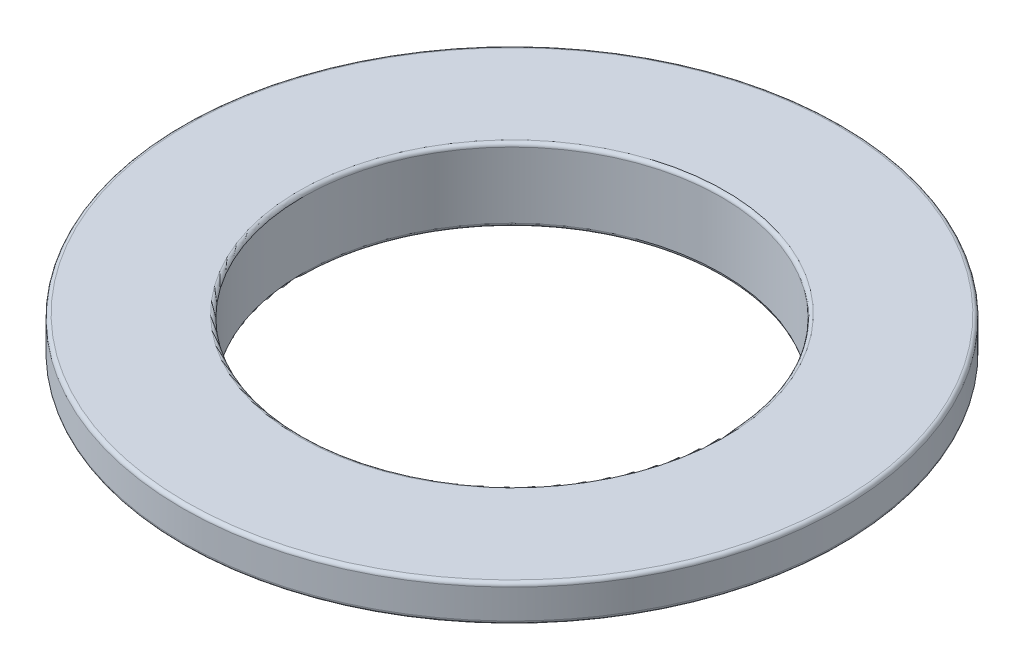
ISO-10303-21;
HEADER;
FILE_DESCRIPTION(('STEP AP214'),'2;1');
FILE_NAME('part.step','',(''),(''),'','','');
FILE_SCHEMA(('AUTOMOTIVE_DESIGN { 1 0 10303 214 1 1 1 1 }'));
ENDSEC;
DATA;
#1=APPLICATION_CONTEXT('core data for automotive mechanical design processes');
#2=APPLICATION_PROTOCOL_DEFINITION('international standard','automotive_design',2000,#1);
#3=PRODUCT_CONTEXT('',#1,'mechanical');
#4=PRODUCT('Part','Part','',(#3));
#5=PRODUCT_RELATED_PRODUCT_CATEGORY('part','',(#4));
#6=PRODUCT_DEFINITION_FORMATION('','',#4);
#7=PRODUCT_DEFINITION_CONTEXT('part definition',#1,'design');
#8=PRODUCT_DEFINITION('design','',#6,#7);
#9=PRODUCT_DEFINITION_SHAPE('','',#8);
#10=(LENGTH_UNIT() NAMED_UNIT(*) SI_UNIT(.MILLI.,.METRE.));
#11=(NAMED_UNIT(*) PLANE_ANGLE_UNIT() SI_UNIT($,.RADIAN.));
#12=(NAMED_UNIT(*) SI_UNIT($,.STERADIAN.) SOLID_ANGLE_UNIT());
#13=UNCERTAINTY_MEASURE_WITH_UNIT(LENGTH_MEASURE(1.E-05),#10,'distance_accuracy_value','');
#14=(GEOMETRIC_REPRESENTATION_CONTEXT(3) GLOBAL_UNCERTAINTY_ASSIGNED_CONTEXT((#13)) GLOBAL_UNIT_ASSIGNED_CONTEXT((#10,
#11,#12)) REPRESENTATION_CONTEXT('',''));
#15=CARTESIAN_POINT('',(0.,0.,0.));
#16=DIRECTION('',(0.,0.,1.));
#17=DIRECTION('',(1.,0.,0.));
#18=AXIS2_PLACEMENT_3D('',#15,#16,#17);
#19=CARTESIAN_POINT('',(0.,0.,0.));
#20=DIRECTION('',(0.,1.,0.));
#21=DIRECTION('',(0.,0.,1.));
#22=AXIS2_PLACEMENT_3D('',#19,#20,#21);
#23=PLANE('',#22);
#24=CARTESIAN_POINT('',(0.,0.,0.));
#25=DIRECTION('',(0.,1.,0.));
#26=DIRECTION('',(0.,0.,1.));
#27=AXIS2_PLACEMENT_3D('',#24,#25,#26);
#28=CIRCLE('',#27,16.5639320225002);
#29=CARTESIAN_POINT('',(0.,0.,16.5639320225002));
#30=VERTEX_POINT('',#29);
#31=EDGE_CURVE('E80',#30,#30,#28,.F.);
#32=ORIENTED_EDGE('',*,*,#31,.T.);
#33=EDGE_LOOP('',(#32));
#34=FACE_BOUND('',#33,.T.);
#35=CARTESIAN_POINT('',(0.,0.,0.));
#36=DIRECTION('',(0.,1.,0.));
#37=DIRECTION('',(0.,0.,1.));
#38=AXIS2_PLACEMENT_3D('',#35,#36,#37);
#39=CIRCLE('',#38,14.55);
#40=CARTESIAN_POINT('',(0.,0.,14.55));
#41=VERTEX_POINT('',#40);
#42=EDGE_CURVE('E83',#41,#41,#39,.T.);
#43=ORIENTED_EDGE('',*,*,#42,.T.);
#44=EDGE_LOOP('',(#43));
#45=FACE_BOUND('',#44,.T.);
#46=ADVANCED_FACE('F36',(#34,#45),#23,.F.);
#47=CARTESIAN_POINT('',(0.,0.,0.));
#48=DIRECTION('',(0.,-1.,0.));
#49=DIRECTION('',(0.,0.,-1.));
#50=AXIS2_PLACEMENT_3D('',#47,#48,#49);
#51=TOROIDAL_SURFACE('',#50,18.8,2.);
#52=CARTESIAN_POINT('',(0.,0.222222222222222,0.));
#53=DIRECTION('',(0.,-1.,0.));
#54=DIRECTION('',(0.,0.,-1.));
#55=AXIS2_PLACEMENT_3D('',#52,#53,#54);
#56=CIRCLE('',#55,16.8123840200002);
#57=CARTESIAN_POINT('',(0.,0.222222222222222,-16.8123840200002));
#58=VERTEX_POINT('',#57);
#59=EDGE_CURVE('E74',#58,#58,#56,.F.);
#60=ORIENTED_EDGE('',*,*,#59,.T.);
#61=EDGE_LOOP('',(#60));
#62=FACE_BOUND('',#61,.T.);
#63=CARTESIAN_POINT('',(0.,1.76886655485623,0.));
#64=DIRECTION('',(0.,-1.,0.));
#65=DIRECTION('',(0.,0.,-1.));
#66=AXIS2_PLACEMENT_3D('',#63,#64,#65);
#67=CIRCLE('',#66,17.8666666666667);
#68=CARTESIAN_POINT('',(0.,1.76886655485623,-17.8666666666667));
#69=VERTEX_POINT('',#68);
#70=EDGE_CURVE('E77',#69,#69,#67,.T.);
#71=ORIENTED_EDGE('',*,*,#70,.T.);
#72=EDGE_LOOP('',(#71));
#73=FACE_BOUND('',#72,.T.);
#74=ADVANCED_FACE('F113',(#62,#73),#51,.F.);
#75=CARTESIAN_POINT('',(0.,0.,0.));
#76=DIRECTION('',(0.,-1.,0.));
#77=DIRECTION('',(0.,0.,-1.));
#78=AXIS2_PLACEMENT_3D('',#75,#76,#77);
#79=CYLINDRICAL_SURFACE('',#78,18.);
#80=CARTESIAN_POINT('',(0.,1.98997487421324,0.));
#81=DIRECTION('',(0.,1.,0.));
#82=DIRECTION('',(0.,0.,1.));
#83=AXIS2_PLACEMENT_3D('',#80,#81,#82);
#84=CIRCLE('',#83,18.);
#85=CARTESIAN_POINT('',(0.,1.98997487421324,18.));
#86=VERTEX_POINT('',#85);
#87=EDGE_CURVE('E68',#86,#86,#84,.T.);
#88=ORIENTED_EDGE('',*,*,#87,.T.);
#89=EDGE_LOOP('',(#88));
#90=FACE_BOUND('',#89,.T.);
#91=CARTESIAN_POINT('',(0.,2.25,0.));
#92=DIRECTION('',(0.,-1.,0.));
#93=DIRECTION('',(0.,0.,-1.));
#94=AXIS2_PLACEMENT_3D('',#91,#92,#93);
#95=CIRCLE('',#94,18.);
#96=CARTESIAN_POINT('',(0.,2.25,-18.));
#97=VERTEX_POINT('',#96);
#98=EDGE_CURVE('E71',#97,#97,#95,.T.);
#99=ORIENTED_EDGE('',*,*,#98,.T.);
#100=EDGE_LOOP('',(#99));
#101=FACE_BOUND('',#100,.T.);
#102=ADVANCED_FACE('F119',(#90,#101),#79,.T.);
#103=CARTESIAN_POINT('',(0.,2.5,0.));
#104=DIRECTION('',(0.,-1.,0.));
#105=DIRECTION('',(0.,0.,-1.));
#106=AXIS2_PLACEMENT_3D('',#103,#104,#105);
#107=PLANE('',#106);
#108=CARTESIAN_POINT('',(0.,2.5,0.));
#109=DIRECTION('',(0.,-1.,0.));
#110=DIRECTION('',(0.,0.,-1.));
#111=AXIS2_PLACEMENT_3D('',#108,#109,#110);
#112=CIRCLE('',#111,18.25);
#113=CARTESIAN_POINT('',(0.,2.5,-18.25));
#114=VERTEX_POINT('',#113);
#115=EDGE_CURVE('E62',#114,#114,#112,.F.);
#116=ORIENTED_EDGE('',*,*,#115,.T.);
#117=EDGE_LOOP('',(#116));
#118=FACE_BOUND('',#117,.T.);
#119=CARTESIAN_POINT('',(0.,2.5,0.));
#120=DIRECTION('',(0.,-1.,0.));
#121=DIRECTION('',(0.,0.,-1.));
#122=AXIS2_PLACEMENT_3D('',#119,#120,#121);
#123=CIRCLE('',#122,22.25);
#124=CARTESIAN_POINT('',(0.,2.5,-22.25));
#125=VERTEX_POINT('',#124);
#126=EDGE_CURVE('E65',#125,#125,#123,.T.);
#127=ORIENTED_EDGE('',*,*,#126,.T.);
#128=EDGE_LOOP('',(#127));
#129=FACE_BOUND('',#128,.T.);
#130=ADVANCED_FACE('F142',(#118,#129),#107,.T.);
#131=CARTESIAN_POINT('',(0.,0.,0.));
#132=DIRECTION('',(0.,-1.,0.));
#133=DIRECTION('',(0.,0.,-1.));
#134=AXIS2_PLACEMENT_3D('',#131,#132,#133);
#135=CYLINDRICAL_SURFACE('',#134,22.5);
#136=CARTESIAN_POINT('',(0.,2.75,0.));
#137=DIRECTION('',(0.,-1.,0.));
#138=DIRECTION('',(0.,0.,-1.));
#139=AXIS2_PLACEMENT_3D('',#136,#137,#138);
#140=CIRCLE('',#139,22.5);
#141=CARTESIAN_POINT('',(0.,2.75,-22.5));
#142=VERTEX_POINT('',#141);
#143=EDGE_CURVE('E10',#142,#142,#140,.F.);
#144=ORIENTED_EDGE('',*,*,#143,.T.);
#145=EDGE_LOOP('',(#144));
#146=FACE_BOUND('',#145,.T.);
#147=CARTESIAN_POINT('',(0.,4.75,0.));
#148=DIRECTION('',(0.,1.,0.));
#149=DIRECTION('',(0.,0.,1.));
#150=AXIS2_PLACEMENT_3D('',#147,#148,#149);
#151=CIRCLE('',#150,22.5);
#152=CARTESIAN_POINT('',(0.,4.75,22.5));
#153=VERTEX_POINT('',#152);
#154=EDGE_CURVE('E43',#153,#153,#151,.F.);
#155=ORIENTED_EDGE('',*,*,#154,.T.);
#156=EDGE_LOOP('',(#155));
#157=FACE_BOUND('',#156,.T.);
#158=ADVANCED_FACE('F109',(#146,#157),#135,.T.);
#159=CARTESIAN_POINT('',(0.,5.,0.));
#160=DIRECTION('',(0.,1.,0.));
#161=DIRECTION('',(0.,0.,1.));
#162=AXIS2_PLACEMENT_3D('',#159,#160,#161);
#163=PLANE('',#162);
#164=CARTESIAN_POINT('',(0.,5.,0.));
#165=DIRECTION('',(0.,1.,0.));
#166=DIRECTION('',(0.,0.,1.));
#167=AXIS2_PLACEMENT_3D('',#164,#165,#166);
#168=CIRCLE('',#167,14.55);
#169=CARTESIAN_POINT('',(0.,5.,14.55));
#170=VERTEX_POINT('',#169);
#171=EDGE_CURVE('E56',#170,#170,#168,.F.);
#172=ORIENTED_EDGE('',*,*,#171,.T.);
#173=EDGE_LOOP('',(#172));
#174=FACE_BOUND('',#173,.T.);
#175=CARTESIAN_POINT('',(0.,5.,0.));
#176=DIRECTION('',(0.,1.,0.));
#177=DIRECTION('',(0.,0.,1.));
#178=AXIS2_PLACEMENT_3D('',#175,#176,#177);
#179=CIRCLE('',#178,22.25);
#180=CARTESIAN_POINT('',(0.,5.,22.25));
#181=VERTEX_POINT('',#180);
#182=EDGE_CURVE('E59',#181,#181,#179,.T.);
#183=ORIENTED_EDGE('',*,*,#182,.T.);
#184=EDGE_LOOP('',(#183));
#185=FACE_BOUND('',#184,.T.);
#186=ADVANCED_FACE('F99',(#174,#185),#163,.T.);
#187=CARTESIAN_POINT('',(0.,0.,0.));
#188=DIRECTION('',(0.,-1.,0.));
#189=DIRECTION('',(0.,0.,-1.));
#190=AXIS2_PLACEMENT_3D('',#187,#188,#189);
#191=CYLINDRICAL_SURFACE('',#190,14.3);
#192=CARTESIAN_POINT('',(0.,4.75,0.));
#193=DIRECTION('',(0.,1.,0.));
#194=DIRECTION('',(0.,0.,1.));
#195=AXIS2_PLACEMENT_3D('',#192,#193,#194);
#196=CIRCLE('',#195,14.3);
#197=CARTESIAN_POINT('',(0.,4.75,14.3));
#198=VERTEX_POINT('',#197);
#199=EDGE_CURVE('E47',#198,#198,#196,.T.);
#200=ORIENTED_EDGE('',*,*,#199,.T.);
#201=EDGE_LOOP('',(#200));
#202=FACE_BOUND('',#201,.T.);
#203=CARTESIAN_POINT('',(0.,0.25,0.));
#204=DIRECTION('',(0.,1.,0.));
#205=DIRECTION('',(0.,0.,1.));
#206=AXIS2_PLACEMENT_3D('',#203,#204,#205);
#207=CIRCLE('',#206,14.3);
#208=CARTESIAN_POINT('',(0.,0.25,14.3));
#209=VERTEX_POINT('',#208);
#210=EDGE_CURVE('E51',#209,#209,#207,.F.);
#211=ORIENTED_EDGE('',*,*,#210,.T.);
#212=EDGE_LOOP('',(#211));
#213=FACE_BOUND('',#212,.T.);
#214=ADVANCED_FACE('F96',(#202,#213),#191,.F.);
#215=CARTESIAN_POINT('',(0.,0.25,0.));
#216=DIRECTION('',(0.,-1.,0.));
#217=DIRECTION('',(0.,0.,-1.));
#218=AXIS2_PLACEMENT_3D('',#215,#216,#217);
#219=TOROIDAL_SURFACE('',#218,16.5639320225002,0.25);
#220=ORIENTED_EDGE('',*,*,#59,.F.);
#221=EDGE_LOOP('',(#220));
#222=FACE_BOUND('',#221,.T.);
#223=ORIENTED_EDGE('',*,*,#31,.F.);
#224=EDGE_LOOP('',(#223));
#225=FACE_BOUND('',#224,.T.);
#226=ADVANCED_FACE('F98',(#222,#225),#219,.T.);
#227=CARTESIAN_POINT('',(0.,1.98997487421324,0.));
#228=DIRECTION('',(0.,1.,0.));
#229=DIRECTION('',(0.,0.,1.));
#230=AXIS2_PLACEMENT_3D('',#227,#228,#229);
#231=TOROIDAL_SURFACE('',#230,17.75,0.25);
#232=ORIENTED_EDGE('',*,*,#87,.F.);
#233=EDGE_LOOP('',(#232));
#234=FACE_BOUND('',#233,.T.);
#235=ORIENTED_EDGE('',*,*,#70,.F.);
#236=EDGE_LOOP('',(#235));
#237=FACE_BOUND('',#236,.T.);
#238=ADVANCED_FACE('F106',(#234,#237),#231,.T.);
#239=CARTESIAN_POINT('',(0.,2.25,0.));
#240=DIRECTION('',(0.,-1.,0.));
#241=DIRECTION('',(0.,0.,-1.));
#242=AXIS2_PLACEMENT_3D('',#239,#240,#241);
#243=TOROIDAL_SURFACE('',#242,18.25,0.25);
#244=ORIENTED_EDGE('',*,*,#115,.F.);
#245=EDGE_LOOP('',(#244));
#246=FACE_BOUND('',#245,.T.);
#247=ORIENTED_EDGE('',*,*,#98,.F.);
#248=EDGE_LOOP('',(#247));
#249=FACE_BOUND('',#248,.T.);
#250=ADVANCED_FACE('F126',(#246,#249),#243,.F.);
#251=CARTESIAN_POINT('',(0.,4.75,0.));
#252=DIRECTION('',(0.,1.,0.));
#253=DIRECTION('',(0.,0.,1.));
#254=AXIS2_PLACEMENT_3D('',#251,#252,#253);
#255=TOROIDAL_SURFACE('',#254,14.55,0.25);
#256=ORIENTED_EDGE('',*,*,#199,.F.);
#257=EDGE_LOOP('',(#256));
#258=FACE_BOUND('',#257,.T.);
#259=ORIENTED_EDGE('',*,*,#171,.F.);
#260=EDGE_LOOP('',(#259));
#261=FACE_BOUND('',#260,.T.);
#262=ADVANCED_FACE('F92',(#258,#261),#255,.T.);
#263=CARTESIAN_POINT('',(0.,0.25,0.));
#264=DIRECTION('',(0.,1.,0.));
#265=DIRECTION('',(0.,0.,1.));
#266=AXIS2_PLACEMENT_3D('',#263,#264,#265);
#267=TOROIDAL_SURFACE('',#266,14.55,0.25);
#268=ORIENTED_EDGE('',*,*,#42,.F.);
#269=EDGE_LOOP('',(#268));
#270=FACE_BOUND('',#269,.T.);
#271=ORIENTED_EDGE('',*,*,#210,.F.);
#272=EDGE_LOOP('',(#271));
#273=FACE_BOUND('',#272,.T.);
#274=ADVANCED_FACE('F88',(#270,#273),#267,.T.);
#275=CARTESIAN_POINT('',(0.,2.75,0.));
#276=DIRECTION('',(0.,-1.,0.));
#277=DIRECTION('',(0.,0.,-1.));
#278=AXIS2_PLACEMENT_3D('',#275,#276,#277);
#279=TOROIDAL_SURFACE('',#278,22.25,0.25);
#280=ORIENTED_EDGE('',*,*,#143,.F.);
#281=EDGE_LOOP('',(#280));
#282=FACE_BOUND('',#281,.T.);
#283=ORIENTED_EDGE('',*,*,#126,.F.);
#284=EDGE_LOOP('',(#283));
#285=FACE_BOUND('',#284,.T.);
#286=ADVANCED_FACE('F91',(#282,#285),#279,.T.);
#287=CARTESIAN_POINT('',(0.,4.75,0.));
#288=DIRECTION('',(0.,1.,0.));
#289=DIRECTION('',(0.,0.,1.));
#290=AXIS2_PLACEMENT_3D('',#287,#288,#289);
#291=TOROIDAL_SURFACE('',#290,22.25,0.25);
#292=ORIENTED_EDGE('',*,*,#182,.F.);
#293=EDGE_LOOP('',(#292));
#294=FACE_BOUND('',#293,.T.);
#295=ORIENTED_EDGE('',*,*,#154,.F.);
#296=EDGE_LOOP('',(#295));
#297=FACE_BOUND('',#296,.T.);
#298=ADVANCED_FACE('F38',(#294,#297),#291,.T.);
#299=CLOSED_SHELL('',(#46,#74,#102,#130,#158,#186,#214,#226,#238,#250,#262,#274,#286,#298));
#300=MANIFOLD_SOLID_BREP('B2',#299);
#301=ADVANCED_BREP_SHAPE_REPRESENTATION('',(#18,#300),#14);
#302=SHAPE_DEFINITION_REPRESENTATION(#9,#301);
ENDSEC;
END-ISO-10303-21;
